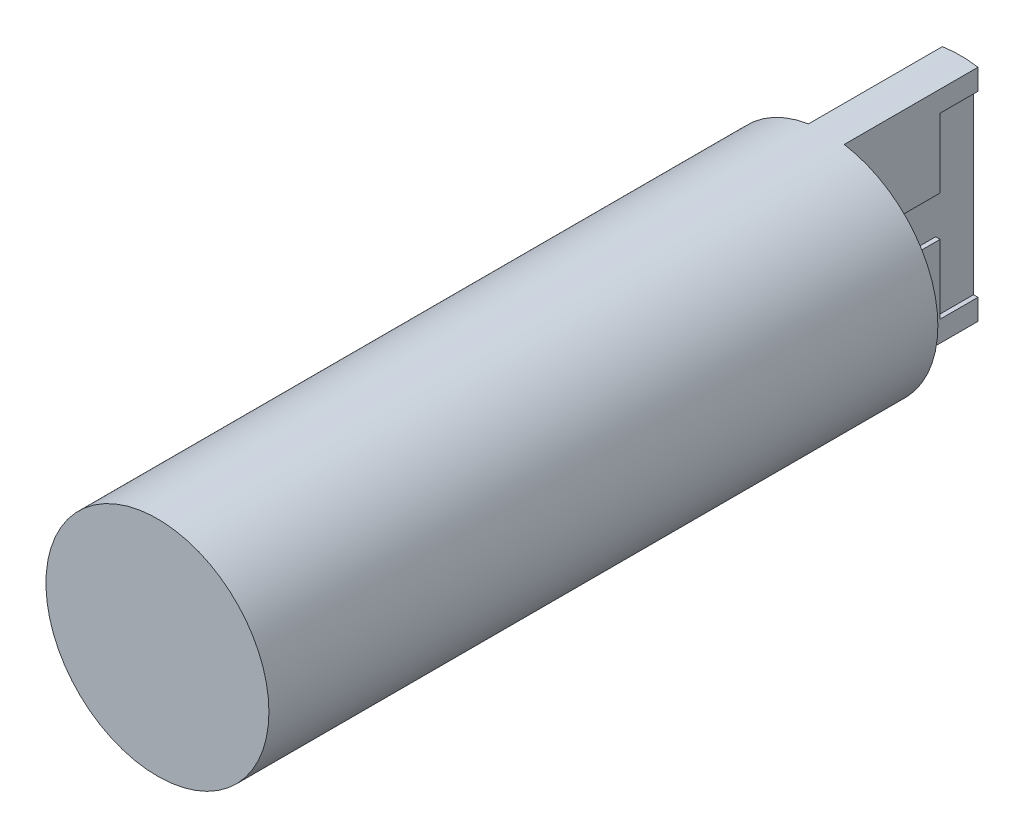
ISO-10303-21;
HEADER;
FILE_DESCRIPTION(('STEP AP214'),'2;1');
FILE_NAME('part.step','',(''),(''),'','','');
FILE_SCHEMA(('AUTOMOTIVE_DESIGN { 1 0 10303 214 1 1 1 1 }'));
ENDSEC;
DATA;
#1=APPLICATION_CONTEXT('core data for automotive mechanical design processes');
#2=APPLICATION_PROTOCOL_DEFINITION('international standard','automotive_design',2000,#1);
#3=PRODUCT_CONTEXT('',#1,'mechanical');
#4=PRODUCT('Part','Part','',(#3));
#5=PRODUCT_RELATED_PRODUCT_CATEGORY('part','',(#4));
#6=PRODUCT_DEFINITION_FORMATION('','',#4);
#7=PRODUCT_DEFINITION_CONTEXT('part definition',#1,'design');
#8=PRODUCT_DEFINITION('design','',#6,#7);
#9=PRODUCT_DEFINITION_SHAPE('','',#8);
#10=(LENGTH_UNIT() NAMED_UNIT(*) SI_UNIT(.MILLI.,.METRE.));
#11=(NAMED_UNIT(*) PLANE_ANGLE_UNIT() SI_UNIT($,.RADIAN.));
#12=(NAMED_UNIT(*) SI_UNIT($,.STERADIAN.) SOLID_ANGLE_UNIT());
#13=UNCERTAINTY_MEASURE_WITH_UNIT(LENGTH_MEASURE(1.E-05),#10,'distance_accuracy_value','');
#14=(GEOMETRIC_REPRESENTATION_CONTEXT(3) GLOBAL_UNCERTAINTY_ASSIGNED_CONTEXT((#13)) GLOBAL_UNIT_ASSIGNED_CONTEXT((#10,
#11,#12)) REPRESENTATION_CONTEXT('',''));
#15=CARTESIAN_POINT('',(0.,0.,0.));
#16=DIRECTION('',(0.,0.,1.));
#17=DIRECTION('',(1.,0.,0.));
#18=AXIS2_PLACEMENT_3D('',#15,#16,#17);
#19=CARTESIAN_POINT('',(0.,0.,0.));
#20=DIRECTION('',(0.,0.,1.));
#21=DIRECTION('',(1.,0.,0.));
#22=AXIS2_PLACEMENT_3D('',#19,#20,#21);
#23=PLANE('',#22);
#24=DIRECTION('',(0.,1.,0.));
#25=VECTOR('',#24,1.);
#26=CARTESIAN_POINT('',(-4.,-24.6779253585061,0.));
#27=LINE('',#26,#25);
#28=CARTESIAN_POINT('',(-4.,-24.6779253585061,0.));
#29=VERTEX_POINT('',#28);
#30=CARTESIAN_POINT('',(-4.,24.6779253585061,0.));
#31=VERTEX_POINT('',#30);
#32=EDGE_CURVE('E67',#29,#31,#27,.T.);
#33=ORIENTED_EDGE('',*,*,#32,.F.);
#34=CARTESIAN_POINT('',(0.,0.,0.));
#35=DIRECTION('',(0.,0.,1.));
#36=DIRECTION('',(1.,0.,0.));
#37=AXIS2_PLACEMENT_3D('',#34,#35,#36);
#38=CIRCLE('',#37,25.);
#39=EDGE_CURVE('E234',#31,#29,#38,.T.);
#40=ORIENTED_EDGE('',*,*,#39,.F.);
#41=EDGE_LOOP('',(#33,#40));
#42=FACE_BOUND('',#41,.T.);
#43=ADVANCED_FACE('F45',(#42),#23,.F.);
#44=DIRECTION('',(0.,-1.,0.));
#45=VECTOR('',#44,1.);
#46=CARTESIAN_POINT('',(4.,-24.6779253585061,0.));
#47=LINE('',#46,#45);
#48=CARTESIAN_POINT('',(4.,24.6779253585061,0.));
#49=VERTEX_POINT('',#48);
#50=CARTESIAN_POINT('',(4.00000000000001,-24.6779253585061,0.));
#51=VERTEX_POINT('',#50);
#52=EDGE_CURVE('E201',#49,#51,#47,.T.);
#53=ORIENTED_EDGE('',*,*,#52,.F.);
#54=EDGE_CURVE('E229',#51,#49,#38,.T.);
#55=ORIENTED_EDGE('',*,*,#54,.F.);
#56=EDGE_LOOP('',(#53,#55));
#57=FACE_BOUND('',#56,.T.);
#58=ADVANCED_FACE('F272',(#57),#23,.F.);
#59=CARTESIAN_POINT('',(0.,0.,150.));
#60=DIRECTION('',(0.,0.,-1.));
#61=DIRECTION('',(-1.,0.,0.));
#62=AXIS2_PLACEMENT_3D('',#59,#60,#61);
#63=CYLINDRICAL_SURFACE('',#62,25.);
#64=CARTESIAN_POINT('',(0.,0.,150.));
#65=DIRECTION('',(0.,0.,1.));
#66=DIRECTION('',(1.,0.,0.));
#67=AXIS2_PLACEMENT_3D('',#64,#65,#66);
#68=CIRCLE('',#67,25.);
#69=CARTESIAN_POINT('',(25.,0.,150.));
#70=VERTEX_POINT('',#69);
#71=EDGE_CURVE('E230',#70,#70,#68,.T.);
#72=ORIENTED_EDGE('',*,*,#71,.F.);
#73=EDGE_LOOP('',(#72));
#74=FACE_BOUND('',#73,.T.);
#75=ORIENTED_EDGE('',*,*,#54,.T.);
#76=DIRECTION('',(0.,0.,1.));
#77=VECTOR('',#76,1.);
#78=CARTESIAN_POINT('',(4.,24.6779253585061,-30.));
#79=LINE('',#78,#77);
#80=CARTESIAN_POINT('',(4.,24.6779253585061,-30.));
#81=VERTEX_POINT('',#80);
#82=EDGE_CURVE('E226',#81,#49,#79,.T.);
#83=ORIENTED_EDGE('',*,*,#82,.F.);
#84=CARTESIAN_POINT('',(0.,0.,-30.));
#85=DIRECTION('',(0.,0.,-1.));
#86=DIRECTION('',(-1.,0.,0.));
#87=AXIS2_PLACEMENT_3D('',#84,#85,#86);
#88=CIRCLE('',#87,25.);
#89=CARTESIAN_POINT('',(-4.,24.6779253585061,-30.));
#90=VERTEX_POINT('',#89);
#91=EDGE_CURVE('E202',#90,#81,#88,.T.);
#92=ORIENTED_EDGE('',*,*,#91,.F.);
#93=DIRECTION('',(0.,0.,1.));
#94=VECTOR('',#93,1.);
#95=CARTESIAN_POINT('',(-4.,24.6779253585061,-30.));
#96=LINE('',#95,#94);
#97=EDGE_CURVE('E214',#90,#31,#96,.T.);
#98=ORIENTED_EDGE('',*,*,#97,.T.);
#99=ORIENTED_EDGE('',*,*,#39,.T.);
#100=DIRECTION('',(0.,0.,1.));
#101=VECTOR('',#100,1.);
#102=CARTESIAN_POINT('',(-4.,-24.6779253585061,-30.));
#103=LINE('',#102,#101);
#104=CARTESIAN_POINT('',(-4.,-24.6779253585061,-30.));
#105=VERTEX_POINT('',#104);
#106=EDGE_CURVE('E220',#105,#29,#103,.T.);
#107=ORIENTED_EDGE('',*,*,#106,.F.);
#108=CARTESIAN_POINT('',(0.,0.,-30.));
#109=DIRECTION('',(0.,0.,-1.));
#110=DIRECTION('',(-1.,0.,0.));
#111=AXIS2_PLACEMENT_3D('',#108,#109,#110);
#112=CIRCLE('',#111,25.);
#113=CARTESIAN_POINT('',(4.00000000000001,-24.6779253585061,-30.));
#114=VERTEX_POINT('',#113);
#115=EDGE_CURVE('E209',#114,#105,#112,.T.);
#116=ORIENTED_EDGE('',*,*,#115,.F.);
#117=DIRECTION('',(0.,0.,1.));
#118=VECTOR('',#117,1.);
#119=CARTESIAN_POINT('',(4.00000000000001,-24.6779253585061,-30.));
#120=LINE('',#119,#118);
#121=EDGE_CURVE('E223',#114,#51,#120,.T.);
#122=ORIENTED_EDGE('',*,*,#121,.T.);
#123=EDGE_LOOP('',(#75,#83,#92,#98,#99,#107,#116,#122));
#124=FACE_BOUND('',#123,.T.);
#125=ADVANCED_FACE('F47',(#74,#124),#63,.T.);
#126=CARTESIAN_POINT('',(0.,0.,150.));
#127=DIRECTION('',(0.,0.,1.));
#128=DIRECTION('',(1.,0.,0.));
#129=AXIS2_PLACEMENT_3D('',#126,#127,#128);
#130=PLANE('',#129);
#131=ORIENTED_EDGE('',*,*,#71,.T.);
#132=EDGE_LOOP('',(#131));
#133=FACE_BOUND('',#132,.T.);
#134=ADVANCED_FACE('F278',(#133),#130,.T.);
#135=CARTESIAN_POINT('',(4.,-24.6779253585061,-30.));
#136=DIRECTION('',(-1.,0.,0.));
#137=DIRECTION('',(0.,0.,1.));
#138=AXIS2_PLACEMENT_3D('',#135,#136,#137);
#139=PLANE('',#138);
#140=DIRECTION('',(0.,-1.,0.));
#141=VECTOR('',#140,1.);
#142=CARTESIAN_POINT('',(4.,4.5,-21.5));
#143=LINE('',#142,#141);
#144=CARTESIAN_POINT('',(4.,20.,-21.5));
#145=VERTEX_POINT('',#144);
#146=CARTESIAN_POINT('',(4.,4.5,-21.5));
#147=VERTEX_POINT('',#146);
#148=EDGE_CURVE('E163',#145,#147,#143,.T.);
#149=ORIENTED_EDGE('',*,*,#148,.F.);
#150=DIRECTION('',(0.,0.,1.));
#151=VECTOR('',#150,1.);
#152=CARTESIAN_POINT('',(4.,20.,-30.5));
#153=LINE('',#152,#151);
#154=CARTESIAN_POINT('',(4.,20.,-30.));
#155=VERTEX_POINT('',#154);
#156=EDGE_CURVE('E181',#155,#145,#153,.T.);
#157=ORIENTED_EDGE('',*,*,#156,.F.);
#158=DIRECTION('',(0.,-1.,0.));
#159=VECTOR('',#158,1.);
#160=CARTESIAN_POINT('',(4.,-24.6779253585061,-30.));
#161=LINE('',#160,#159);
#162=EDGE_CURVE('E206',#81,#155,#161,.T.);
#163=ORIENTED_EDGE('',*,*,#162,.F.);
#164=ORIENTED_EDGE('',*,*,#82,.T.);
#165=ORIENTED_EDGE('',*,*,#52,.T.);
#166=ORIENTED_EDGE('',*,*,#121,.F.);
#167=CARTESIAN_POINT('',(4.,-20.,-30.));
#168=VERTEX_POINT('',#167);
#169=EDGE_CURVE('E205',#168,#114,#161,.T.);
#170=ORIENTED_EDGE('',*,*,#169,.F.);
#171=DIRECTION('',(0.,0.,-1.));
#172=VECTOR('',#171,1.);
#173=CARTESIAN_POINT('',(4.,-20.,-30.5));
#174=LINE('',#173,#172);
#175=CARTESIAN_POINT('',(4.,-20.,-21.5));
#176=VERTEX_POINT('',#175);
#177=EDGE_CURVE('E179',#176,#168,#174,.T.);
#178=ORIENTED_EDGE('',*,*,#177,.F.);
#179=DIRECTION('',(0.,-1.,0.));
#180=VECTOR('',#179,1.);
#181=CARTESIAN_POINT('',(4.,-20.,-21.5));
#182=LINE('',#181,#180);
#183=CARTESIAN_POINT('',(4.,-4.5,-21.5));
#184=VERTEX_POINT('',#183);
#185=EDGE_CURVE('E176',#184,#176,#182,.T.);
#186=ORIENTED_EDGE('',*,*,#185,.F.);
#187=DIRECTION('',(0.,0.,-1.));
#188=VECTOR('',#187,1.);
#189=CARTESIAN_POINT('',(4.,-4.5,-6.));
#190=LINE('',#189,#188);
#191=CARTESIAN_POINT('',(4.,-4.5,-6.));
#192=VERTEX_POINT('',#191);
#193=EDGE_CURVE('E174',#192,#184,#190,.T.);
#194=ORIENTED_EDGE('',*,*,#193,.F.);
#195=DIRECTION('',(0.,-1.,0.));
#196=VECTOR('',#195,1.);
#197=CARTESIAN_POINT('',(4.,4.5,-6.));
#198=LINE('',#197,#196);
#199=CARTESIAN_POINT('',(4.,4.5,-6.));
#200=VERTEX_POINT('',#199);
#201=EDGE_CURVE('E144',#200,#192,#198,.T.);
#202=ORIENTED_EDGE('',*,*,#201,.F.);
#203=DIRECTION('',(0.,0.,1.));
#204=VECTOR('',#203,1.);
#205=CARTESIAN_POINT('',(4.,4.5,-6.));
#206=LINE('',#205,#204);
#207=EDGE_CURVE('E160',#147,#200,#206,.T.);
#208=ORIENTED_EDGE('',*,*,#207,.F.);
#209=EDGE_LOOP('',(#149,#157,#163,#164,#165,#166,#170,#178,#186,#194,#202,#208));
#210=FACE_BOUND('',#209,.T.);
#211=ADVANCED_FACE('F259',(#210),#139,.F.);
#212=CARTESIAN_POINT('',(-4.,-24.6779253585061,-30.));
#213=DIRECTION('',(1.,0.,0.));
#214=DIRECTION('',(0.,0.,-1.));
#215=AXIS2_PLACEMENT_3D('',#212,#213,#214);
#216=PLANE('',#215);
#217=DIRECTION('',(0.,1.,0.));
#218=VECTOR('',#217,1.);
#219=CARTESIAN_POINT('',(-4.,-24.6779253585061,-30.));
#220=LINE('',#219,#218);
#221=CARTESIAN_POINT('',(-4.,0.,-30.));
#222=VERTEX_POINT('',#221);
#223=EDGE_CURVE('E211',#222,#90,#220,.T.);
#224=ORIENTED_EDGE('',*,*,#223,.F.);
#225=CARTESIAN_POINT('',(-4.,0.,-26.));
#226=DIRECTION('',(-1.,0.,0.));
#227=DIRECTION('',(0.,0.,1.));
#228=AXIS2_PLACEMENT_3D('',#225,#226,#227);
#229=CIRCLE('',#228,4.);
#230=EDGE_CURVE('E187',#222,#222,#229,.T.);
#231=ORIENTED_EDGE('',*,*,#230,.F.);
#232=EDGE_CURVE('E212',#105,#222,#220,.T.);
#233=ORIENTED_EDGE('',*,*,#232,.F.);
#234=ORIENTED_EDGE('',*,*,#106,.T.);
#235=ORIENTED_EDGE('',*,*,#32,.T.);
#236=ORIENTED_EDGE('',*,*,#97,.F.);
#237=EDGE_LOOP('',(#224,#231,#233,#234,#235,#236));
#238=FACE_BOUND('',#237,.T.);
#239=ADVANCED_FACE('F284',(#238),#216,.F.);
#240=CARTESIAN_POINT('',(0.,0.,-30.));
#241=DIRECTION('',(0.,0.,-1.));
#242=DIRECTION('',(-1.,0.,0.));
#243=AXIS2_PLACEMENT_3D('',#240,#241,#242);
#244=PLANE('',#243);
#245=DIRECTION('',(1.,0.,0.));
#246=VECTOR('',#245,1.);
#247=CARTESIAN_POINT('',(0.,20.,-30.));
#248=LINE('',#247,#246);
#249=CARTESIAN_POINT('',(3.,20.,-30.));
#250=VERTEX_POINT('',#249);
#251=EDGE_CURVE('E13',#250,#155,#248,.T.);
#252=ORIENTED_EDGE('',*,*,#251,.F.);
#253=DIRECTION('',(0.,-1.,0.));
#254=VECTOR('',#253,1.);
#255=CARTESIAN_POINT('',(3.,0.,-30.));
#256=LINE('',#255,#254);
#257=CARTESIAN_POINT('',(3.,-20.,-30.));
#258=VERTEX_POINT('',#257);
#259=EDGE_CURVE('E233',#250,#258,#256,.T.);
#260=ORIENTED_EDGE('',*,*,#259,.T.);
#261=DIRECTION('',(-1.,0.,0.));
#262=VECTOR('',#261,1.);
#263=CARTESIAN_POINT('',(0.,-20.,-30.));
#264=LINE('',#263,#262);
#265=EDGE_CURVE('E53',#168,#258,#264,.T.);
#266=ORIENTED_EDGE('',*,*,#265,.F.);
#267=ORIENTED_EDGE('',*,*,#169,.T.);
#268=ORIENTED_EDGE('',*,*,#115,.T.);
#269=ORIENTED_EDGE('',*,*,#232,.T.);
#270=ORIENTED_EDGE('',*,*,#223,.T.);
#271=ORIENTED_EDGE('',*,*,#91,.T.);
#272=ORIENTED_EDGE('',*,*,#162,.T.);
#273=EDGE_LOOP('',(#252,#260,#266,#267,#268,#269,#270,#271,#272));
#274=FACE_BOUND('',#273,.T.);
#275=ADVANCED_FACE('F245',(#274),#244,.T.);
#276=CARTESIAN_POINT('',(-4.,0.,-26.));
#277=DIRECTION('',(1.,0.,0.));
#278=DIRECTION('',(0.,0.,1.));
#279=AXIS2_PLACEMENT_3D('',#276,#277,#278);
#280=CONICAL_SURFACE('',#279,4.,0.0174532925199433);
#281=CARTESIAN_POINT('',(-13.,0.,-26.));
#282=DIRECTION('',(-1.,0.,0.));
#283=DIRECTION('',(0.,0.,1.));
#284=AXIS2_PLACEMENT_3D('',#281,#282,#283);
#285=CIRCLE('',#284,3.84290441564604);
#286=CARTESIAN_POINT('',(-13.,0.,-22.157095584354));
#287=VERTEX_POINT('',#286);
#288=EDGE_CURVE('E198',#287,#287,#285,.T.);
#289=ORIENTED_EDGE('',*,*,#288,.F.);
#290=EDGE_LOOP('',(#289));
#291=FACE_BOUND('',#290,.T.);
#292=ORIENTED_EDGE('',*,*,#230,.T.);
#293=EDGE_LOOP('',(#292));
#294=FACE_BOUND('',#293,.T.);
#295=ADVANCED_FACE('F290',(#291,#294),#280,.T.);
#296=CARTESIAN_POINT('',(-13.,0.,-26.));
#297=DIRECTION('',(-1.,0.,0.));
#298=DIRECTION('',(0.,0.,1.));
#299=AXIS2_PLACEMENT_3D('',#296,#297,#298);
#300=PLANE('',#299);
#301=ORIENTED_EDGE('',*,*,#288,.T.);
#302=EDGE_LOOP('',(#301));
#303=FACE_BOUND('',#302,.T.);
#304=ADVANCED_FACE('F293',(#303),#300,.T.);
#305=CARTESIAN_POINT('',(3.,4.5,-6.));
#306=DIRECTION('',(0.,0.,1.));
#307=DIRECTION('',(1.,0.,0.));
#308=AXIS2_PLACEMENT_3D('',#305,#306,#307);
#309=PLANE('',#308);
#310=ORIENTED_EDGE('',*,*,#201,.T.);
#311=DIRECTION('',(1.,0.,0.));
#312=VECTOR('',#311,1.);
#313=CARTESIAN_POINT('',(3.,-4.5,-6.));
#314=LINE('',#313,#312);
#315=CARTESIAN_POINT('',(3.,-4.5,-6.));
#316=VERTEX_POINT('',#315);
#317=EDGE_CURVE('E137',#316,#192,#314,.T.);
#318=ORIENTED_EDGE('',*,*,#317,.F.);
#319=DIRECTION('',(0.,-1.,0.));
#320=VECTOR('',#319,1.);
#321=CARTESIAN_POINT('',(3.,4.5,-6.));
#322=LINE('',#321,#320);
#323=CARTESIAN_POINT('',(3.,4.5,-6.));
#324=VERTEX_POINT('',#323);
#325=EDGE_CURVE('E141',#324,#316,#322,.T.);
#326=ORIENTED_EDGE('',*,*,#325,.F.);
#327=DIRECTION('',(1.,0.,0.));
#328=VECTOR('',#327,1.);
#329=CARTESIAN_POINT('',(3.,4.5,-6.));
#330=LINE('',#329,#328);
#331=EDGE_CURVE('E185',#324,#200,#330,.T.);
#332=ORIENTED_EDGE('',*,*,#331,.T.);
#333=EDGE_LOOP('',(#310,#318,#326,#332));
#334=FACE_BOUND('',#333,.T.);
#335=ADVANCED_FACE('F139',(#334),#309,.F.);
#336=CARTESIAN_POINT('',(3.,4.5,-6.));
#337=DIRECTION('',(0.,1.,0.));
#338=DIRECTION('',(0.,0.,1.));
#339=AXIS2_PLACEMENT_3D('',#336,#337,#338);
#340=PLANE('',#339);
#341=ORIENTED_EDGE('',*,*,#207,.T.);
#342=ORIENTED_EDGE('',*,*,#331,.F.);
#343=DIRECTION('',(0.,0.,1.));
#344=VECTOR('',#343,1.);
#345=CARTESIAN_POINT('',(3.,4.5,-6.));
#346=LINE('',#345,#344);
#347=CARTESIAN_POINT('',(3.,4.5,-21.5));
#348=VERTEX_POINT('',#347);
#349=EDGE_CURVE('E149',#348,#324,#346,.T.);
#350=ORIENTED_EDGE('',*,*,#349,.F.);
#351=DIRECTION('',(1.,0.,0.));
#352=VECTOR('',#351,1.);
#353=CARTESIAN_POINT('',(3.,4.5,-21.5));
#354=LINE('',#353,#352);
#355=EDGE_CURVE('E188',#348,#147,#354,.T.);
#356=ORIENTED_EDGE('',*,*,#355,.T.);
#357=EDGE_LOOP('',(#341,#342,#350,#356));
#358=FACE_BOUND('',#357,.T.);
#359=ADVANCED_FACE('F256',(#358),#340,.F.);
#360=CARTESIAN_POINT('',(3.,4.5,-21.5));
#361=DIRECTION('',(0.,0.,1.));
#362=DIRECTION('',(1.,0.,0.));
#363=AXIS2_PLACEMENT_3D('',#360,#361,#362);
#364=PLANE('',#363);
#365=ORIENTED_EDGE('',*,*,#148,.T.);
#366=ORIENTED_EDGE('',*,*,#355,.F.);
#367=DIRECTION('',(0.,-1.,0.));
#368=VECTOR('',#367,1.);
#369=CARTESIAN_POINT('',(3.,4.5,-21.5));
#370=LINE('',#369,#368);
#371=CARTESIAN_POINT('',(3.,20.,-21.5));
#372=VERTEX_POINT('',#371);
#373=EDGE_CURVE('E170',#372,#348,#370,.T.);
#374=ORIENTED_EDGE('',*,*,#373,.F.);
#375=DIRECTION('',(1.,0.,0.));
#376=VECTOR('',#375,1.);
#377=CARTESIAN_POINT('',(3.,20.,-21.5));
#378=LINE('',#377,#376);
#379=EDGE_CURVE('E190',#372,#145,#378,.T.);
#380=ORIENTED_EDGE('',*,*,#379,.T.);
#381=EDGE_LOOP('',(#365,#366,#374,#380));
#382=FACE_BOUND('',#381,.T.);
#383=ADVANCED_FACE('F254',(#382),#364,.F.);
#384=CARTESIAN_POINT('',(3.,20.,-30.5));
#385=DIRECTION('',(0.,1.,0.));
#386=DIRECTION('',(0.,0.,1.));
#387=AXIS2_PLACEMENT_3D('',#384,#385,#386);
#388=PLANE('',#387);
#389=ORIENTED_EDGE('',*,*,#251,.T.);
#390=ORIENTED_EDGE('',*,*,#156,.T.);
#391=ORIENTED_EDGE('',*,*,#379,.F.);
#392=DIRECTION('',(0.,0.,1.));
#393=VECTOR('',#392,1.);
#394=CARTESIAN_POINT('',(3.,20.,-30.5));
#395=LINE('',#394,#393);
#396=EDGE_CURVE('E168',#250,#372,#395,.T.);
#397=ORIENTED_EDGE('',*,*,#396,.F.);
#398=EDGE_LOOP('',(#389,#390,#391,#397));
#399=FACE_BOUND('',#398,.T.);
#400=ADVANCED_FACE('F249',(#399),#388,.F.);
#401=CARTESIAN_POINT('',(3.,-20.,-30.5));
#402=DIRECTION('',(0.,-1.,0.));
#403=DIRECTION('',(0.,0.,-1.));
#404=AXIS2_PLACEMENT_3D('',#401,#402,#403);
#405=PLANE('',#404);
#406=ORIENTED_EDGE('',*,*,#265,.T.);
#407=DIRECTION('',(0.,0.,-1.));
#408=VECTOR('',#407,1.);
#409=CARTESIAN_POINT('',(3.,-20.,-30.5));
#410=LINE('',#409,#408);
#411=CARTESIAN_POINT('',(3.,-20.,-21.5));
#412=VERTEX_POINT('',#411);
#413=EDGE_CURVE('E60',#412,#258,#410,.T.);
#414=ORIENTED_EDGE('',*,*,#413,.F.);
#415=DIRECTION('',(1.,0.,0.));
#416=VECTOR('',#415,1.);
#417=CARTESIAN_POINT('',(3.,-20.,-21.5));
#418=LINE('',#417,#416);
#419=EDGE_CURVE('E193',#412,#176,#418,.T.);
#420=ORIENTED_EDGE('',*,*,#419,.T.);
#421=ORIENTED_EDGE('',*,*,#177,.T.);
#422=EDGE_LOOP('',(#406,#414,#420,#421));
#423=FACE_BOUND('',#422,.T.);
#424=ADVANCED_FACE('F240',(#423),#405,.F.);
#425=CARTESIAN_POINT('',(3.,-20.,-21.5));
#426=DIRECTION('',(0.,0.,1.));
#427=DIRECTION('',(1.,0.,0.));
#428=AXIS2_PLACEMENT_3D('',#425,#426,#427);
#429=PLANE('',#428);
#430=ORIENTED_EDGE('',*,*,#185,.T.);
#431=ORIENTED_EDGE('',*,*,#419,.F.);
#432=DIRECTION('',(0.,-1.,0.));
#433=VECTOR('',#432,1.);
#434=CARTESIAN_POINT('',(3.,-20.,-21.5));
#435=LINE('',#434,#433);
#436=CARTESIAN_POINT('',(3.,-4.5,-21.5));
#437=VERTEX_POINT('',#436);
#438=EDGE_CURVE('E155',#437,#412,#435,.T.);
#439=ORIENTED_EDGE('',*,*,#438,.F.);
#440=DIRECTION('',(1.,0.,0.));
#441=VECTOR('',#440,1.);
#442=CARTESIAN_POINT('',(3.,-4.5,-21.5));
#443=LINE('',#442,#441);
#444=EDGE_CURVE('E148',#437,#184,#443,.T.);
#445=ORIENTED_EDGE('',*,*,#444,.T.);
#446=EDGE_LOOP('',(#430,#431,#439,#445));
#447=FACE_BOUND('',#446,.T.);
#448=ADVANCED_FACE('F262',(#447),#429,.F.);
#449=CARTESIAN_POINT('',(3.,-4.5,-6.));
#450=DIRECTION('',(0.,-1.,0.));
#451=DIRECTION('',(0.,0.,-1.));
#452=AXIS2_PLACEMENT_3D('',#449,#450,#451);
#453=PLANE('',#452);
#454=ORIENTED_EDGE('',*,*,#193,.T.);
#455=ORIENTED_EDGE('',*,*,#444,.F.);
#456=DIRECTION('',(0.,0.,-1.));
#457=VECTOR('',#456,1.);
#458=CARTESIAN_POINT('',(3.,-4.5,-6.));
#459=LINE('',#458,#457);
#460=EDGE_CURVE('E152',#316,#437,#459,.T.);
#461=ORIENTED_EDGE('',*,*,#460,.F.);
#462=ORIENTED_EDGE('',*,*,#317,.T.);
#463=EDGE_LOOP('',(#454,#455,#461,#462));
#464=FACE_BOUND('',#463,.T.);
#465=ADVANCED_FACE('F153',(#464),#453,.F.);
#466=CARTESIAN_POINT('',(3.,0.,0.));
#467=DIRECTION('',(1.,0.,0.));
#468=DIRECTION('',(0.,0.,-1.));
#469=AXIS2_PLACEMENT_3D('',#466,#467,#468);
#470=PLANE('',#469);
#471=ORIENTED_EDGE('',*,*,#396,.T.);
#472=ORIENTED_EDGE('',*,*,#373,.T.);
#473=ORIENTED_EDGE('',*,*,#349,.T.);
#474=ORIENTED_EDGE('',*,*,#325,.T.);
#475=ORIENTED_EDGE('',*,*,#460,.T.);
#476=ORIENTED_EDGE('',*,*,#438,.T.);
#477=ORIENTED_EDGE('',*,*,#413,.T.);
#478=ORIENTED_EDGE('',*,*,#259,.F.);
#479=EDGE_LOOP('',(#471,#472,#473,#474,#475,#476,#477,#478));
#480=FACE_BOUND('',#479,.T.);
#481=ADVANCED_FACE('F157',(#480),#470,.T.);
#482=CLOSED_SHELL('',(#43,#58,#125,#134,#211,#239,#275,#295,#304,#335,#359,#383,#400,#424,#448,
#465,#481));
#483=MANIFOLD_SOLID_BREP('B2',#482);
#484=ADVANCED_BREP_SHAPE_REPRESENTATION('',(#18,#483),#14);
#485=SHAPE_DEFINITION_REPRESENTATION(#9,#484);
ENDSEC;
END-ISO-10303-21;
